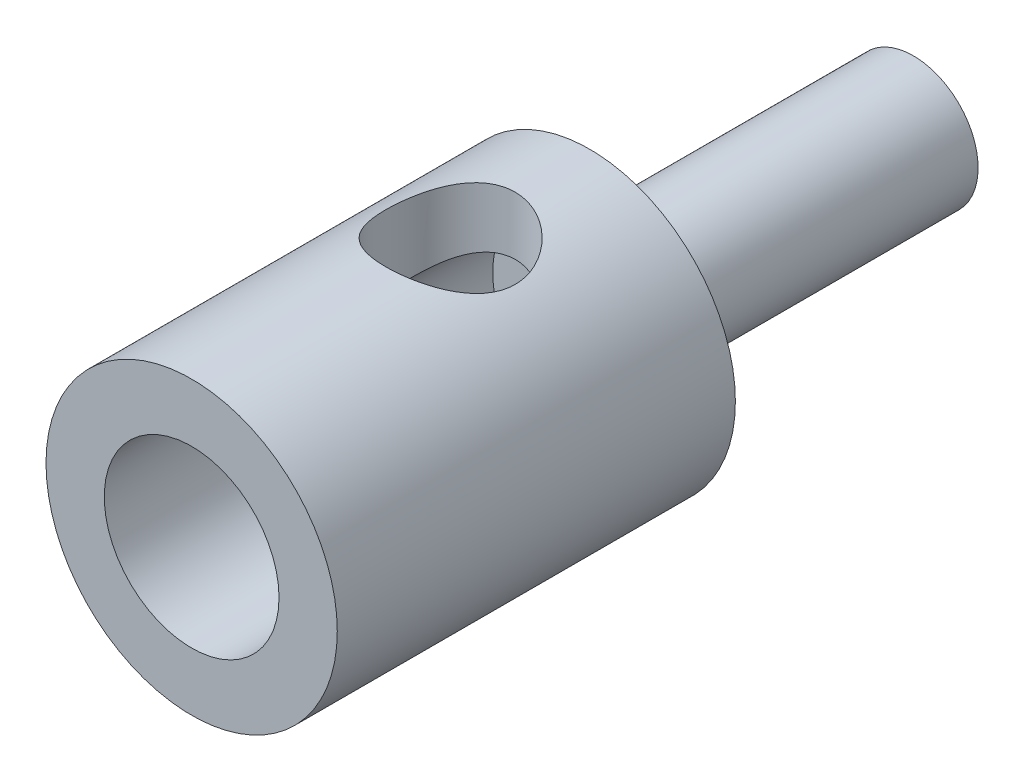
ISO-10303-21;
HEADER;
FILE_DESCRIPTION(('STEP AP214'),'2;1');
FILE_NAME('part.step','',(''),(''),'','','');
FILE_SCHEMA(('AUTOMOTIVE_DESIGN { 1 0 10303 214 1 1 1 1 }'));
ENDSEC;
DATA;
#1=APPLICATION_CONTEXT('core data for automotive mechanical design processes');
#2=APPLICATION_PROTOCOL_DEFINITION('international standard','automotive_design',2000,#1);
#3=PRODUCT_CONTEXT('',#1,'mechanical');
#4=PRODUCT('Part','Part','',(#3));
#5=PRODUCT_RELATED_PRODUCT_CATEGORY('part','',(#4));
#6=PRODUCT_DEFINITION_FORMATION('','',#4);
#7=PRODUCT_DEFINITION_CONTEXT('part definition',#1,'design');
#8=PRODUCT_DEFINITION('design','',#6,#7);
#9=PRODUCT_DEFINITION_SHAPE('','',#8);
#10=(LENGTH_UNIT() NAMED_UNIT(*) SI_UNIT(.MILLI.,.METRE.));
#11=(NAMED_UNIT(*) PLANE_ANGLE_UNIT() SI_UNIT($,.RADIAN.));
#12=(NAMED_UNIT(*) SI_UNIT($,.STERADIAN.) SOLID_ANGLE_UNIT());
#13=UNCERTAINTY_MEASURE_WITH_UNIT(LENGTH_MEASURE(1.E-05),#10,'distance_accuracy_value','');
#14=(GEOMETRIC_REPRESENTATION_CONTEXT(3) GLOBAL_UNCERTAINTY_ASSIGNED_CONTEXT((#13)) GLOBAL_UNIT_ASSIGNED_CONTEXT((#10,
#11,#12)) REPRESENTATION_CONTEXT('',''));
#15=CARTESIAN_POINT('',(0.,0.,0.));
#16=DIRECTION('',(0.,0.,1.));
#17=DIRECTION('',(1.,0.,0.));
#18=AXIS2_PLACEMENT_3D('',#15,#16,#17);
#19=CARTESIAN_POINT('',(0.,0.,6.15));
#20=DIRECTION('',(0.,0.,-1.));
#21=DIRECTION('',(-1.,0.,0.));
#22=AXIS2_PLACEMENT_3D('',#19,#20,#21);
#23=CYLINDRICAL_SURFACE('',#22,2.25);
#24=CARTESIAN_POINT('',(0.,2.25,1.15));
#25=CARTESIAN_POINT('',(0.0532554659185888,2.24999511135048,1.15000634735056));
#26=CARTESIAN_POINT('',(0.106577530436506,2.24808803498228,1.15427875681069));
#27=CARTESIAN_POINT('',(0.211696313341408,2.24064250175497,1.17120818566956));
#28=CARTESIAN_POINT('',(0.263489053440063,2.23509531958046,1.18388535198421));
#29=CARTESIAN_POINT('',(0.363850916966471,2.22096174879085,1.21705050914179));
#30=CARTESIAN_POINT('',(0.412430824006016,2.21238621117243,1.23751063256734));
#31=CARTESIAN_POINT('',(0.505415730249007,2.19301475825376,1.28553756681614));
#32=CARTESIAN_POINT('',(0.549821677957487,2.1822193491909,1.31310275770515));
#33=CARTESIAN_POINT('',(0.635739992499942,2.15879993616987,1.37616744140146));
#34=CARTESIAN_POINT('',(0.676990818164825,2.14611090344928,1.41199882728389));
#35=CARTESIAN_POINT('',(0.753128325004851,2.12059265317293,1.48987412590395));
#36=CARTESIAN_POINT('',(0.788011212567855,2.10776335684879,1.53192171504266));
#37=CARTESIAN_POINT('',(0.852423036191427,2.08258023551527,1.62396936266794));
#38=CARTESIAN_POINT('',(0.881526558016591,2.07029663189321,1.67428840760411));
#39=CARTESIAN_POINT('',(0.930740290188398,2.04864605580411,1.77972762300731));
#40=CARTESIAN_POINT('',(0.950855750666059,2.03927738163432,1.83484496813589));
#41=CARTESIAN_POINT('',(0.980405762251773,2.02523112420835,1.94531019032072));
#42=CARTESIAN_POINT('',(0.990346584909238,2.02033266269295,2.00049336723043));
#43=CARTESIAN_POINT('',(1.00083914149177,2.01515731968729,2.11194488505288));
#44=CARTESIAN_POINT('',(1.00139714603473,2.01487735162058,2.1682124760636));
#45=CARTESIAN_POINT('',(0.993485821512556,2.01878638355473,2.27484772432154));
#46=CARTESIAN_POINT('',(0.985820019509856,2.02257762855117,2.32529268458681));
#47=CARTESIAN_POINT('',(0.963040506308283,2.03352181022502,2.42408761247633));
#48=CARTESIAN_POINT('',(0.947925121354023,2.04067550235269,2.47243710663887));
#49=CARTESIAN_POINT('',(0.910376035627727,2.05770428570701,2.56696681386647));
#50=CARTESIAN_POINT('',(0.887785678682018,2.06763685897519,2.61307397257057));
#51=CARTESIAN_POINT('',(0.836040587446696,2.08909539162215,2.70103795723706));
#52=CARTESIAN_POINT('',(0.806883089335638,2.10062202107855,2.74289298287025));
#53=CARTESIAN_POINT('',(0.739504042519738,2.12533319458153,2.8254568007386));
#54=CARTESIAN_POINT('',(0.70067621379179,2.13856986016634,2.86565673920871));
#55=CARTESIAN_POINT('',(0.616719106061996,2.1642744980616,2.93915872177867));
#56=CARTESIAN_POINT('',(0.5715879288621,2.1767422371801,2.97245868047995));
#57=CARTESIAN_POINT('',(0.474576379255935,2.19996224486656,3.03210661386102));
#58=CARTESIAN_POINT('',(0.422536018799482,2.21065295965384,3.05822017159668));
#59=CARTESIAN_POINT('',(0.314203711433232,2.22862790336672,3.10113847495609));
#60=CARTESIAN_POINT('',(0.257914470354028,2.23591427938232,3.11794908911149));
#61=CARTESIAN_POINT('',(0.146910267747264,2.2458412921952,3.14065594134303));
#62=CARTESIAN_POINT('',(0.0923605815208482,2.24877123051482,3.14723334862549));
#63=CARTESIAN_POINT('',(-0.0171385193954918,2.2506000193263,3.15135156153442));
#64=CARTESIAN_POINT('',(-0.0720877919819429,2.24950023903332,3.14889543656749));
#65=CARTESIAN_POINT('',(-0.177453708369244,2.24357647772824,3.13547821365958));
#66=CARTESIAN_POINT('',(-0.227948208866323,2.23897258878825,3.12501955374025));
#67=CARTESIAN_POINT('',(-0.326396036479248,2.22675271157043,3.09662101044848));
#68=CARTESIAN_POINT('',(-0.37434905396292,2.21913635723226,3.07868021786873));
#69=CARTESIAN_POINT('',(-0.46805202596665,2.20131188670333,3.0352555587948));
#70=CARTESIAN_POINT('',(-0.513686576668193,2.19103032614157,3.00955382644281));
#71=CARTESIAN_POINT('',(-0.600159639375065,2.16894061525661,2.95157428699106));
#72=CARTESIAN_POINT('',(-0.640996050392065,2.15713180090545,2.91929361592732));
#73=CARTESIAN_POINT('',(-0.72018360626788,2.13206396576625,2.84604161010067));
#74=CARTESIAN_POINT('',(-0.75806919369852,2.1187647704964,2.80457953125976));
#75=CARTESIAN_POINT('',(-0.82650121133195,2.09302067475821,2.71572232984223));
#76=CARTESIAN_POINT('',(-0.857045039647483,2.08057607826871,2.66832511290301));
#77=CARTESIAN_POINT('',(-0.91053786568531,2.05773895078273,2.56743784609541));
#78=CARTESIAN_POINT('',(-0.933291638639681,2.04740148035177,2.51383084181563));
#79=CARTESIAN_POINT('',(-0.969232460087628,2.03063751400259,2.40293659234795));
#80=CARTESIAN_POINT('',(-0.982428871839502,2.02420719128545,2.34565300914476));
#81=CARTESIAN_POINT('',(-0.997892739114449,2.01662526778851,2.23425921190186));
#82=CARTESIAN_POINT('',(-1.00099172334628,2.01507244117414,2.18029156070324));
#83=CARTESIAN_POINT('',(-0.998453874399204,2.01633144598305,2.0726201984324));
#84=CARTESIAN_POINT('',(-0.992818903993759,2.01914234671295,2.01891643352912));
#85=CARTESIAN_POINT('',(-0.973701132763464,2.0284248239616,1.91665403625126));
#86=CARTESIAN_POINT('',(-0.960710860144593,2.03466599695481,1.86798024005687));
#87=CARTESIAN_POINT('',(-0.927770972929371,2.04989473409227,1.77350904090075));
#88=CARTESIAN_POINT('',(-0.907819346374624,2.05888309212992,1.72771247403129));
#89=CARTESIAN_POINT('',(-0.860060545804444,2.07930527884415,1.63708119418944));
#90=CARTESIAN_POINT('',(-0.831831914674672,2.09085890484882,1.59249616870949));
#91=CARTESIAN_POINT('',(-0.768867986661113,2.11482294535827,1.50843759973141));
#92=CARTESIAN_POINT('',(-0.734129972078894,2.12723371635363,1.46896620288178));
#93=CARTESIAN_POINT('',(-0.655540642347484,2.15281618226999,1.39268876734829));
#94=CARTESIAN_POINT('',(-0.611157950232165,2.16595947242195,1.35641791728769));
#95=CARTESIAN_POINT('',(-0.516475905666192,2.19046588398484,1.29178249272621));
#96=CARTESIAN_POINT('',(-0.466173865202286,2.20182819113615,1.26342153000878));
#97=CARTESIAN_POINT('',(-0.361525056195783,2.22139629471516,1.21588769398026));
#98=CARTESIAN_POINT('',(-0.307230454369046,2.22963633024829,1.19661455362951));
#99=CARTESIAN_POINT('',(-0.195810676259318,2.24215858416623,1.16768151182));
#100=CARTESIAN_POINT('',(-0.138694699549948,2.24645287290451,1.15799228540073));
#101=CARTESIAN_POINT('',(-0.054182016207977,2.24951242368149,1.15109819230376));
#102=CARTESIAN_POINT('',(-0.0270996306091857,2.25000248764317,1.14999677008073));
#103=CARTESIAN_POINT('',(0.,2.25,1.15));
#104=B_SPLINE_CURVE_WITH_KNOTS('',3,(#24,#25,#26,#27,#28,#29,#30,#31,#32,#33,#34,#35,#36,#37,
#38,#39,#40,#41,#42,#43,#44,#45,#46,#47,#48,#49,#50,#51,#52,#53,#54,#55,#56,#57,#58,#59,#60,#61,
#62,#63,#64,#65,#66,#67,#68,#69,#70,#71,#72,#73,#74,#75,#76,#77,#78,#79,#80,#81,#82,#83,#84,#85,
#86,#87,#88,#89,#90,#91,#92,#93,#94,#95,#96,#97,#98,#99,#100,#101,#102,#103),.UNSPECIFIED.,.T.,
.F.,(4,2,2,2,2,2,2,2,2,2,2,2,2,2,2,2,2,2,2,2,2,2,2,2,2,2,2,2,2,2,2,2,2,2,2,2,2,2,2,4),(0.,
0.159681878910111,0.319747919519924,0.479246146549302,0.638708040574723,0.806269554300142,
0.973930567049548,1.15127198270406,1.32850967335026,1.49642237746342,1.66422285961174,
1.81700425015333,1.96981998293039,2.12606592660329,2.28237775061561,2.45391673374921,
2.62550748617086,2.80216697951325,2.97871490418316,3.1429140648838,3.30705743927524,
3.46166393102078,3.61628921558037,3.7757384777183,3.93525730063716,4.1076325833433,
4.28006886532161,4.45655507823355,4.63286815448326,4.79423699929667,4.95557143217939,
5.10719982475701,5.2588720770592,5.4202634852214,5.58172242580081,5.75730509177075,
5.93296780087361,6.10664422570444,6.27978757430918,6.36104345779088),.UNSPECIFIED.);
#105=CARTESIAN_POINT('',(0.,2.25,1.15));
#106=VERTEX_POINT('',#105);
#107=EDGE_CURVE('E94',#106,#106,#104,.T.);
#108=ORIENTED_EDGE('',*,*,#107,.T.);
#109=EDGE_LOOP('',(#108));
#110=FACE_BOUND('',#109,.T.);
#111=CARTESIAN_POINT('',(0.,-2.25,1.15));
#112=CARTESIAN_POINT('',(-0.0532554659185888,-2.24999511135048,1.15000634735056));
#113=CARTESIAN_POINT('',(-0.106577530436506,-2.24808803498228,1.15427875681069));
#114=CARTESIAN_POINT('',(-0.211696313341408,-2.24064250175497,1.17120818566956));
#115=CARTESIAN_POINT('',(-0.263489053440063,-2.23509531958046,1.18388535198421));
#116=CARTESIAN_POINT('',(-0.363850916966471,-2.22096174879085,1.21705050914179));
#117=CARTESIAN_POINT('',(-0.412430824006016,-2.21238621117243,1.23751063256734));
#118=CARTESIAN_POINT('',(-0.505415730249007,-2.19301475825376,1.28553756681614));
#119=CARTESIAN_POINT('',(-0.549821677957487,-2.1822193491909,1.31310275770515));
#120=CARTESIAN_POINT('',(-0.635739992499942,-2.15879993616987,1.37616744140146));
#121=CARTESIAN_POINT('',(-0.676990818164825,-2.14611090344928,1.41199882728389));
#122=CARTESIAN_POINT('',(-0.753128325004851,-2.12059265317293,1.48987412590395));
#123=CARTESIAN_POINT('',(-0.788011212567855,-2.10776335684879,1.53192171504266));
#124=CARTESIAN_POINT('',(-0.852423036191427,-2.08258023551527,1.62396936266794));
#125=CARTESIAN_POINT('',(-0.881526558016591,-2.07029663189321,1.67428840760411));
#126=CARTESIAN_POINT('',(-0.930740290188398,-2.04864605580411,1.77972762300731));
#127=CARTESIAN_POINT('',(-0.950855750666059,-2.03927738163432,1.83484496813589));
#128=CARTESIAN_POINT('',(-0.980405762251773,-2.02523112420835,1.94531019032072));
#129=CARTESIAN_POINT('',(-0.990346584909238,-2.02033266269295,2.00049336723043));
#130=CARTESIAN_POINT('',(-1.00083914149177,-2.01515731968729,2.11194488505288));
#131=CARTESIAN_POINT('',(-1.00139714603473,-2.01487735162058,2.1682124760636));
#132=CARTESIAN_POINT('',(-0.993485821512556,-2.01878638355473,2.27484772432154));
#133=CARTESIAN_POINT('',(-0.985820019509856,-2.02257762855117,2.32529268458681));
#134=CARTESIAN_POINT('',(-0.963040506308283,-2.03352181022502,2.42408761247633));
#135=CARTESIAN_POINT('',(-0.947925121354023,-2.04067550235269,2.47243710663887));
#136=CARTESIAN_POINT('',(-0.910376035627727,-2.05770428570701,2.56696681386647));
#137=CARTESIAN_POINT('',(-0.887785678682018,-2.06763685897519,2.61307397257057));
#138=CARTESIAN_POINT('',(-0.836040587446696,-2.08909539162215,2.70103795723706));
#139=CARTESIAN_POINT('',(-0.806883089335638,-2.10062202107855,2.74289298287025));
#140=CARTESIAN_POINT('',(-0.739504042519738,-2.12533319458153,2.8254568007386));
#141=CARTESIAN_POINT('',(-0.70067621379179,-2.13856986016634,2.86565673920871));
#142=CARTESIAN_POINT('',(-0.616719106061996,-2.1642744980616,2.93915872177867));
#143=CARTESIAN_POINT('',(-0.5715879288621,-2.1767422371801,2.97245868047995));
#144=CARTESIAN_POINT('',(-0.474576379255935,-2.19996224486656,3.03210661386102));
#145=CARTESIAN_POINT('',(-0.422536018799482,-2.21065295965384,3.05822017159668));
#146=CARTESIAN_POINT('',(-0.314203711433232,-2.22862790336672,3.10113847495609));
#147=CARTESIAN_POINT('',(-0.257914470354028,-2.23591427938232,3.11794908911149));
#148=CARTESIAN_POINT('',(-0.146910267747264,-2.2458412921952,3.14065594134303));
#149=CARTESIAN_POINT('',(-0.0923605815208482,-2.24877123051482,3.14723334862549));
#150=CARTESIAN_POINT('',(0.0171385193954918,-2.2506000193263,3.15135156153442));
#151=CARTESIAN_POINT('',(0.0720877919819429,-2.24950023903332,3.14889543656749));
#152=CARTESIAN_POINT('',(0.177453708369244,-2.24357647772824,3.13547821365958));
#153=CARTESIAN_POINT('',(0.227948208866323,-2.23897258878825,3.12501955374025));
#154=CARTESIAN_POINT('',(0.326396036479248,-2.22675271157043,3.09662101044848));
#155=CARTESIAN_POINT('',(0.37434905396292,-2.21913635723226,3.07868021786873));
#156=CARTESIAN_POINT('',(0.46805202596665,-2.20131188670333,3.0352555587948));
#157=CARTESIAN_POINT('',(0.513686576668193,-2.19103032614157,3.00955382644281));
#158=CARTESIAN_POINT('',(0.600159639375065,-2.16894061525661,2.95157428699106));
#159=CARTESIAN_POINT('',(0.640996050392065,-2.15713180090545,2.91929361592732));
#160=CARTESIAN_POINT('',(0.72018360626788,-2.13206396576625,2.84604161010067));
#161=CARTESIAN_POINT('',(0.75806919369852,-2.1187647704964,2.80457953125976));
#162=CARTESIAN_POINT('',(0.82650121133195,-2.09302067475821,2.71572232984223));
#163=CARTESIAN_POINT('',(0.857045039647483,-2.08057607826871,2.66832511290301));
#164=CARTESIAN_POINT('',(0.91053786568531,-2.05773895078273,2.56743784609541));
#165=CARTESIAN_POINT('',(0.933291638639681,-2.04740148035177,2.51383084181563));
#166=CARTESIAN_POINT('',(0.969232460087628,-2.03063751400259,2.40293659234795));
#167=CARTESIAN_POINT('',(0.982428871839502,-2.02420719128545,2.34565300914476));
#168=CARTESIAN_POINT('',(0.997892739114449,-2.01662526778851,2.23425921190186));
#169=CARTESIAN_POINT('',(1.00099172334628,-2.01507244117414,2.18029156070324));
#170=CARTESIAN_POINT('',(0.998453874399204,-2.01633144598305,2.0726201984324));
#171=CARTESIAN_POINT('',(0.992818903993759,-2.01914234671295,2.01891643352912));
#172=CARTESIAN_POINT('',(0.973701132763464,-2.0284248239616,1.91665403625126));
#173=CARTESIAN_POINT('',(0.960710860144593,-2.03466599695481,1.86798024005687));
#174=CARTESIAN_POINT('',(0.927770972929371,-2.04989473409227,1.77350904090075));
#175=CARTESIAN_POINT('',(0.907819346374624,-2.05888309212992,1.72771247403129));
#176=CARTESIAN_POINT('',(0.860060545804444,-2.07930527884415,1.63708119418944));
#177=CARTESIAN_POINT('',(0.831831914674672,-2.09085890484882,1.59249616870949));
#178=CARTESIAN_POINT('',(0.768867986661113,-2.11482294535827,1.50843759973141));
#179=CARTESIAN_POINT('',(0.734129972078894,-2.12723371635363,1.46896620288178));
#180=CARTESIAN_POINT('',(0.655540642347484,-2.15281618226999,1.39268876734829));
#181=CARTESIAN_POINT('',(0.611157950232165,-2.16595947242195,1.35641791728769));
#182=CARTESIAN_POINT('',(0.516475905666192,-2.19046588398484,1.29178249272621));
#183=CARTESIAN_POINT('',(0.466173865202286,-2.20182819113615,1.26342153000878));
#184=CARTESIAN_POINT('',(0.361525056195783,-2.22139629471516,1.21588769398026));
#185=CARTESIAN_POINT('',(0.307230454369046,-2.22963633024829,1.19661455362951));
#186=CARTESIAN_POINT('',(0.195810676259318,-2.24215858416623,1.16768151182));
#187=CARTESIAN_POINT('',(0.138694699549948,-2.24645287290451,1.15799228540073));
#188=CARTESIAN_POINT('',(0.054182016207977,-2.24951242368149,1.15109819230376));
#189=CARTESIAN_POINT('',(0.0270996306091857,-2.25000248764317,1.14999677008073));
#190=CARTESIAN_POINT('',(0.,-2.25,1.15));
#191=B_SPLINE_CURVE_WITH_KNOTS('',3,(#111,#112,#113,#114,#115,#116,#117,#118,#119,#120,#121,
#122,#123,#124,#125,#126,#127,#128,#129,#130,#131,#132,#133,#134,#135,#136,#137,#138,#139,#140,
#141,#142,#143,#144,#145,#146,#147,#148,#149,#150,#151,#152,#153,#154,#155,#156,#157,#158,#159,
#160,#161,#162,#163,#164,#165,#166,#167,#168,#169,#170,#171,#172,#173,#174,#175,#176,#177,#178,
#179,#180,#181,#182,#183,#184,#185,#186,#187,#188,#189,#190),.UNSPECIFIED.,.T.,.F.,(4,2,2,2,2,2,
2,2,2,2,2,2,2,2,2,2,2,2,2,2,2,2,2,2,2,2,2,2,2,2,2,2,2,2,2,2,2,2,2,4),(0.,0.159681878910111,
0.319747919519924,0.479246146549302,0.638708040574723,0.806269554300142,0.973930567049548,
1.15127198270406,1.32850967335026,1.49642237746342,1.66422285961174,1.81700425015333,
1.96981998293039,2.12606592660329,2.28237775061561,2.45391673374921,2.62550748617086,
2.80216697951325,2.97871490418316,3.1429140648838,3.30705743927524,3.46166393102078,
3.61628921558037,3.7757384777183,3.93525730063716,4.1076325833433,4.28006886532161,
4.45655507823355,4.63286815448326,4.79423699929667,4.95557143217939,5.10719982475701,
5.2588720770592,5.4202634852214,5.58172242580081,5.75730509177075,5.93296780087361,
6.10664422570444,6.27978757430918,6.36104345779088),.UNSPECIFIED.);
#192=CARTESIAN_POINT('',(0.,-2.25,1.15));
#193=VERTEX_POINT('',#192);
#194=EDGE_CURVE('E100',#193,#193,#191,.T.);
#195=ORIENTED_EDGE('',*,*,#194,.T.);
#196=EDGE_LOOP('',(#195));
#197=FACE_BOUND('',#196,.T.);
#198=CARTESIAN_POINT('',(0.,0.,6.15));
#199=DIRECTION('',(0.,0.,1.));
#200=DIRECTION('',(1.,0.,0.));
#201=AXIS2_PLACEMENT_3D('',#198,#199,#200);
#202=CIRCLE('',#201,2.25);
#203=CARTESIAN_POINT('',(2.25,0.,6.15));
#204=VERTEX_POINT('',#203);
#205=EDGE_CURVE('E57',#204,#204,#202,.T.);
#206=ORIENTED_EDGE('',*,*,#205,.F.);
#207=EDGE_LOOP('',(#206));
#208=FACE_BOUND('',#207,.T.);
#209=CARTESIAN_POINT('',(0.,0.,0.));
#210=DIRECTION('',(0.,0.,1.));
#211=DIRECTION('',(1.,0.,0.));
#212=AXIS2_PLACEMENT_3D('',#209,#210,#211);
#213=CIRCLE('',#212,2.25);
#214=CARTESIAN_POINT('',(2.25,0.,0.));
#215=VERTEX_POINT('',#214);
#216=EDGE_CURVE('E65',#215,#215,#213,.T.);
#217=ORIENTED_EDGE('',*,*,#216,.T.);
#218=EDGE_LOOP('',(#217));
#219=FACE_BOUND('',#218,.T.);
#220=ADVANCED_FACE('F43',(#110,#197,#208,#219),#23,.T.);
#221=CARTESIAN_POINT('',(0.,0.,6.15));
#222=DIRECTION('',(0.,0.,1.));
#223=DIRECTION('',(1.,0.,0.));
#224=AXIS2_PLACEMENT_3D('',#221,#222,#223);
#225=PLANE('',#224);
#226=CARTESIAN_POINT('',(0.,0.,6.15));
#227=DIRECTION('',(0.,0.,1.));
#228=DIRECTION('',(1.,0.,0.));
#229=AXIS2_PLACEMENT_3D('',#226,#227,#228);
#230=CIRCLE('',#229,1.35);
#231=CARTESIAN_POINT('',(1.35,0.,6.15));
#232=VERTEX_POINT('',#231);
#233=EDGE_CURVE('E107',#232,#232,#230,.T.);
#234=ORIENTED_EDGE('',*,*,#233,.F.);
#235=EDGE_LOOP('',(#234));
#236=FACE_BOUND('',#235,.T.);
#237=ORIENTED_EDGE('',*,*,#205,.T.);
#238=EDGE_LOOP('',(#237));
#239=FACE_BOUND('',#238,.T.);
#240=ADVANCED_FACE('F114',(#236,#239),#225,.T.);
#241=CARTESIAN_POINT('',(0.,0.,0.));
#242=DIRECTION('',(0.,0.,1.));
#243=DIRECTION('',(1.,0.,0.));
#244=AXIS2_PLACEMENT_3D('',#241,#242,#243);
#245=PLANE('',#244);
#246=CARTESIAN_POINT('',(0.,0.,0.));
#247=DIRECTION('',(0.,0.,-1.));
#248=DIRECTION('',(-1.,0.,0.));
#249=AXIS2_PLACEMENT_3D('',#246,#247,#248);
#250=CIRCLE('',#249,1.);
#251=CARTESIAN_POINT('',(-1.,0.,0.));
#252=VERTEX_POINT('',#251);
#253=EDGE_CURVE('E10',#252,#252,#250,.T.);
#254=ORIENTED_EDGE('',*,*,#253,.F.);
#255=EDGE_LOOP('',(#254));
#256=FACE_BOUND('',#255,.T.);
#257=ORIENTED_EDGE('',*,*,#216,.F.);
#258=EDGE_LOOP('',(#257));
#259=FACE_BOUND('',#258,.T.);
#260=ADVANCED_FACE('F117',(#256,#259),#245,.F.);
#261=CARTESIAN_POINT('',(0.,0.,-5.));
#262=DIRECTION('',(0.,0.,1.));
#263=DIRECTION('',(1.,0.,0.));
#264=AXIS2_PLACEMENT_3D('',#261,#262,#263);
#265=CYLINDRICAL_SURFACE('',#264,1.);
#266=CARTESIAN_POINT('',(0.,0.,-5.));
#267=DIRECTION('',(0.,0.,-1.));
#268=DIRECTION('',(-1.,0.,0.));
#269=AXIS2_PLACEMENT_3D('',#266,#267,#268);
#270=CIRCLE('',#269,1.);
#271=CARTESIAN_POINT('',(-1.,0.,-5.));
#272=VERTEX_POINT('',#271);
#273=EDGE_CURVE('E68',#272,#272,#270,.T.);
#274=ORIENTED_EDGE('',*,*,#273,.F.);
#275=EDGE_LOOP('',(#274));
#276=FACE_BOUND('',#275,.T.);
#277=ORIENTED_EDGE('',*,*,#253,.T.);
#278=EDGE_LOOP('',(#277));
#279=FACE_BOUND('',#278,.T.);
#280=ADVANCED_FACE('F127',(#276,#279),#265,.T.);
#281=CARTESIAN_POINT('',(0.,0.,-5.));
#282=DIRECTION('',(0.,0.,-1.));
#283=DIRECTION('',(-1.,0.,0.));
#284=AXIS2_PLACEMENT_3D('',#281,#282,#283);
#285=PLANE('',#284);
#286=ORIENTED_EDGE('',*,*,#273,.T.);
#287=EDGE_LOOP('',(#286));
#288=FACE_BOUND('',#287,.T.);
#289=ADVANCED_FACE('F132',(#288),#285,.T.);
#290=CARTESIAN_POINT('',(0.,0.,0.15));
#291=DIRECTION('',(0.,0.,1.));
#292=DIRECTION('',(1.,0.,0.));
#293=AXIS2_PLACEMENT_3D('',#290,#291,#292);
#294=CYLINDRICAL_SURFACE('',#293,1.35);
#295=CARTESIAN_POINT('',(0.,1.35,1.15));
#296=CARTESIAN_POINT('',(-0.0490717243035297,1.35000223958817,1.14999761075042));
#297=CARTESIAN_POINT('',(-0.098131527834166,1.34730318767984,1.1536319930467));
#298=CARTESIAN_POINT('',(-0.194651752872078,1.33677541611671,1.16791458289833));
#299=CARTESIAN_POINT('',(-0.242111641312055,1.32894500418981,1.17856510431352));
#300=CARTESIAN_POINT('',(-0.333870770469534,1.3089034146169,1.20616878180187));
#301=CARTESIAN_POINT('',(-0.378184866096066,1.29671473262148,1.22308958917346));
#302=CARTESIAN_POINT('',(-0.463083361505913,1.26887833136965,1.26244967274579));
#303=CARTESIAN_POINT('',(-0.503667230400916,1.25323012082673,1.28488973278476));
#304=CARTESIAN_POINT('',(-0.58417717297009,1.21792535804948,1.33683361656571));
#305=CARTESIAN_POINT('',(-0.623701191131471,1.19803275892706,1.36679666251675));
#306=CARTESIAN_POINT('',(-0.697500695042431,1.15662763822648,1.43172886689919));
#307=CARTESIAN_POINT('',(-0.731768230666145,1.13511273489584,1.466705456455));
#308=CARTESIAN_POINT('',(-0.801079533032903,1.08759585552227,1.54858699270101));
#309=CARTESIAN_POINT('',(-0.834929570439393,1.06155017084429,1.59648192814709));
#310=CARTESIAN_POINT('',(-0.894205867179263,1.0121158231843,1.69848540570644));
#311=CARTESIAN_POINT('',(-0.919644134856284,0.988723404133989,1.75258494035072));
#312=CARTESIAN_POINT('',(-0.953952551643106,0.955427946519688,1.84737271356679));
#313=CARTESIAN_POINT('',(-0.965516567615825,0.94363789556465,1.88641387459037));
#314=CARTESIAN_POINT('',(-0.983895804701379,0.924460441098843,1.96660577971819));
#315=CARTESIAN_POINT('',(-0.990721885133291,0.91706297547546,2.00775146609966));
#316=CARTESIAN_POINT('',(-0.999185249946116,0.907839671356762,2.09157556821471));
#317=CARTESIAN_POINT('',(-1.0007793895189,0.906060165492432,2.13426380795081));
#318=CARTESIAN_POINT('',(-0.998502556508989,0.908566985857605,2.21932446867285));
#319=CARTESIAN_POINT('',(-0.994628273066616,0.912856986877067,2.26169668270244));
#320=CARTESIAN_POINT('',(-0.981115555029069,0.927370280583237,2.348874750766));
#321=CARTESIAN_POINT('',(-0.970940040374505,0.938143399992382,2.39350096303103));
#322=CARTESIAN_POINT('',(-0.945130171365865,0.964138108515908,2.47980086560265));
#323=CARTESIAN_POINT('',(-0.9294826291478,0.979370429956593,2.52146712774571));
#324=CARTESIAN_POINT('',(-0.886735859817576,1.01848525160047,2.61615469137081));
#325=CARTESIAN_POINT('',(-0.857541399939727,1.04349429270473,2.66775844080754));
#326=CARTESIAN_POINT('',(-0.79097571458433,1.0948207780191,2.76466874412697));
#327=CARTESIAN_POINT('',(-0.753594666539317,1.121139764382,2.80996762548786));
#328=CARTESIAN_POINT('',(-0.670363283866524,1.17284028179552,2.89443422896834));
#329=CARTESIAN_POINT('',(-0.624386421129005,1.1981999315268,2.93349164148448));
#330=CARTESIAN_POINT('',(-0.524847379484645,1.24500733203476,3.00335341713868));
#331=CARTESIAN_POINT('',(-0.471302885117067,1.26646394363861,3.03417655059703));
#332=CARTESIAN_POINT('',(-0.37217493891926,1.29844813399917,3.0793276670848));
#333=CARTESIAN_POINT('',(-0.328041936106571,1.31036740074748,3.09585759036153));
#334=CARTESIAN_POINT('',(-0.236993197669999,1.32984761073527,3.12266666158623));
#335=CARTESIAN_POINT('',(-0.190079553513427,1.3374117849178,3.13295044371466));
#336=CARTESIAN_POINT('',(-0.0945149659758822,1.34754743054154,3.14669750240256));
#337=CARTESIAN_POINT('',(-0.0458575688449894,1.35009785695702,3.15013203033064));
#338=CARTESIAN_POINT('',(0.051427436938527,1.34989639797072,3.14986021381215));
#339=CARTESIAN_POINT('',(0.100055046620466,1.34714470748688,3.14615413187072));
#340=CARTESIAN_POINT('',(0.192533030764888,1.33695695325939,3.13233062657074));
#341=CARTESIAN_POINT('',(0.236486822410695,1.32984222412193,3.12265274097884));
#342=CARTESIAN_POINT('',(0.321966443541335,1.3117728028136,3.09779771411183));
#343=CARTESIAN_POINT('',(0.363491758542286,1.30081730037128,3.08261941241477));
#344=CARTESIAN_POINT('',(0.446372248270804,1.27486321842537,3.04607713274766));
#345=CARTESIAN_POINT('',(0.48748443264255,1.25962429651608,3.02433666465163));
#346=CARTESIAN_POINT('',(0.565574142868966,1.22655100703494,2.97597731805618));
#347=CARTESIAN_POINT('',(0.602549344166405,1.20871519310173,2.94935571881219));
#348=CARTESIAN_POINT('',(0.678478454197445,1.16805139544047,2.88655988190553));
#349=CARTESIAN_POINT('',(0.716553983723964,1.14490744378254,2.84952907978374));
#350=CARTESIAN_POINT('',(0.786329676176369,1.09815758084091,2.77006961391989));
#351=CARTESIAN_POINT('',(0.818023016732996,1.07455120449709,2.72763525217465));
#352=CARTESIAN_POINT('',(0.87252924665869,1.03069002461333,2.64103153398405));
#353=CARTESIAN_POINT('',(0.89582953970162,1.01031662286695,2.59723029909677));
#354=CARTESIAN_POINT('',(0.936057320801927,0.973162776943834,2.50538453335311));
#355=CARTESIAN_POINT('',(0.952997878774205,0.956374994914658,2.45734895832853));
#356=CARTESIAN_POINT('',(0.976280930310418,0.932514509650264,2.36995445519327));
#357=CARTESIAN_POINT('',(0.984210685547723,0.924064443664157,2.33140401470098));
#358=CARTESIAN_POINT('',(0.995475124557304,0.911921417780413,2.25292697486378));
#359=CARTESIAN_POINT('',(0.998817653969926,0.908220336289793,2.21300284519185));
#360=CARTESIAN_POINT('',(1.00065851417375,0.906192808331507,2.1327690139263));
#361=CARTESIAN_POINT('',(0.999141226076505,0.907883690932647,2.0924584851127));
#362=CARTESIAN_POINT('',(0.991358199771393,0.916372877620256,2.01283134757953));
#363=CARTESIAN_POINT('',(0.985085969923593,0.923178163988816,1.97351617365482));
#364=CARTESIAN_POINT('',(0.965986894362039,0.943188224365731,1.88668524698419));
#365=CARTESIAN_POINT('',(0.95186740806068,0.957607617787472,1.83974221969862));
#366=CARTESIAN_POINT('',(0.917614165519523,0.990478273590003,1.74959703246288));
#367=CARTESIAN_POINT('',(0.897465480953337,1.00893951279608,1.70640450529888));
#368=CARTESIAN_POINT('',(0.844888465115746,1.05365160383911,1.61155476449035));
#369=CARTESIAN_POINT('',(0.810589555757431,1.0805766470421,1.56125173447328));
#370=CARTESIAN_POINT('',(0.733475694621197,1.13434152561778,1.46758246147642));
#371=CARTESIAN_POINT('',(0.690655505444754,1.16118129822226,1.42422051438782));
#372=CARTESIAN_POINT('',(0.596655694577723,1.21217706605328,1.3451489279007));
#373=CARTESIAN_POINT('',(0.545444067672191,1.23632216658571,1.30946984652661));
#374=CARTESIAN_POINT('',(0.435547933022253,1.27916084607129,1.24764324063053));
#375=CARTESIAN_POINT('',(0.376881113085337,1.29786699458456,1.22147370374177));
#376=CARTESIAN_POINT('',(0.265417067422596,1.32464951887635,1.18442994291885));
#377=CARTESIAN_POINT('',(0.213593537518461,1.33406395310874,1.1716039054084));
#378=CARTESIAN_POINT('',(0.107840249584173,1.34673450020864,1.15439499457995));
#379=CARTESIAN_POINT('',(0.0539129303411255,1.34999753946366,1.15000262496271));
#380=CARTESIAN_POINT('',(0.,1.35,1.15));
#381=B_SPLINE_CURVE_WITH_KNOTS('',3,(#295,#296,#297,#298,#299,#300,#301,#302,#303,#304,#305,
#306,#307,#308,#309,#310,#311,#312,#313,#314,#315,#316,#317,#318,#319,#320,#321,#322,#323,#324,
#325,#326,#327,#328,#329,#330,#331,#332,#333,#334,#335,#336,#337,#338,#339,#340,#341,#342,#343,
#344,#345,#346,#347,#348,#349,#350,#351,#352,#353,#354,#355,#356,#357,#358,#359,#360,#361,#362,
#363,#364,#365,#366,#367,#368,#369,#370,#371,#372,#373,#374,#375,#376,#377,#378,#379,#380),
.UNSPECIFIED.,.T.,.F.,(4,2,2,2,2,2,2,2,2,2,2,2,2,2,2,2,2,2,2,2,2,2,2,2,2,2,2,2,2,2,2,2,2,2,2,2,
2,2,2,2,2,2,4),(0.,0.146995166442966,0.294038834860604,0.440334226319851,0.586650406499752,
0.746392274220136,0.906373409430832,1.09808076918562,1.28951326079399,1.4162453033043,
1.54268590895595,1.67016661195075,1.79772453132269,1.93802310310116,2.07866215869118,
2.27071665872335,2.46300286768751,2.65838123640217,2.85331035779576,2.9985448061043,
3.14367136901715,3.28940580567434,3.43513488490278,3.57124065956314,3.70737516517045,
3.85364824385415,4.00000310445577,4.17316900947653,4.34651905235811,4.50688275077582,
4.66691505721501,4.7871969324066,4.90727282921303,5.02773502274915,5.14836197301036,
5.30081106197179,5.45364078372119,5.65237421541246,5.85123017316971,6.05086302515519,
6.25003078508705,6.41171002236896,6.57320710202939),.UNSPECIFIED.);
#382=CARTESIAN_POINT('',(0.,1.35,1.15));
#383=VERTEX_POINT('',#382);
#384=EDGE_CURVE('E47',#383,#383,#381,.T.);
#385=ORIENTED_EDGE('',*,*,#384,.T.);
#386=EDGE_LOOP('',(#385));
#387=FACE_BOUND('',#386,.T.);
#388=CARTESIAN_POINT('',(0.,-1.35,1.15));
#389=CARTESIAN_POINT('',(0.0490717243035297,-1.35000223958817,1.14999761075042));
#390=CARTESIAN_POINT('',(0.098131527834166,-1.34730318767984,1.1536319930467));
#391=CARTESIAN_POINT('',(0.194651752872078,-1.33677541611671,1.16791458289833));
#392=CARTESIAN_POINT('',(0.242111641312055,-1.32894500418981,1.17856510431352));
#393=CARTESIAN_POINT('',(0.333870770469534,-1.3089034146169,1.20616878180187));
#394=CARTESIAN_POINT('',(0.378184866096066,-1.29671473262148,1.22308958917346));
#395=CARTESIAN_POINT('',(0.463083361505913,-1.26887833136965,1.26244967274579));
#396=CARTESIAN_POINT('',(0.503667230400916,-1.25323012082673,1.28488973278476));
#397=CARTESIAN_POINT('',(0.58417717297009,-1.21792535804948,1.33683361656571));
#398=CARTESIAN_POINT('',(0.623701191131471,-1.19803275892706,1.36679666251675));
#399=CARTESIAN_POINT('',(0.697500695042431,-1.15662763822648,1.43172886689919));
#400=CARTESIAN_POINT('',(0.731768230666145,-1.13511273489584,1.466705456455));
#401=CARTESIAN_POINT('',(0.801079533032903,-1.08759585552227,1.54858699270101));
#402=CARTESIAN_POINT('',(0.834929570439393,-1.06155017084429,1.59648192814709));
#403=CARTESIAN_POINT('',(0.894205867179263,-1.0121158231843,1.69848540570644));
#404=CARTESIAN_POINT('',(0.919644134856284,-0.988723404133989,1.75258494035072));
#405=CARTESIAN_POINT('',(0.953952551643106,-0.955427946519688,1.84737271356679));
#406=CARTESIAN_POINT('',(0.965516567615825,-0.94363789556465,1.88641387459037));
#407=CARTESIAN_POINT('',(0.983895804701379,-0.924460441098843,1.96660577971819));
#408=CARTESIAN_POINT('',(0.990721885133291,-0.91706297547546,2.00775146609966));
#409=CARTESIAN_POINT('',(0.999185249946116,-0.907839671356762,2.09157556821471));
#410=CARTESIAN_POINT('',(1.0007793895189,-0.906060165492432,2.13426380795081));
#411=CARTESIAN_POINT('',(0.998502556508989,-0.908566985857605,2.21932446867285));
#412=CARTESIAN_POINT('',(0.994628273066616,-0.912856986877067,2.26169668270244));
#413=CARTESIAN_POINT('',(0.981115555029069,-0.927370280583237,2.348874750766));
#414=CARTESIAN_POINT('',(0.970940040374505,-0.938143399992382,2.39350096303103));
#415=CARTESIAN_POINT('',(0.945130171365865,-0.964138108515908,2.47980086560265));
#416=CARTESIAN_POINT('',(0.9294826291478,-0.979370429956593,2.52146712774571));
#417=CARTESIAN_POINT('',(0.886735859817576,-1.01848525160047,2.61615469137081));
#418=CARTESIAN_POINT('',(0.857541399939727,-1.04349429270473,2.66775844080754));
#419=CARTESIAN_POINT('',(0.79097571458433,-1.0948207780191,2.76466874412697));
#420=CARTESIAN_POINT('',(0.753594666539317,-1.121139764382,2.80996762548786));
#421=CARTESIAN_POINT('',(0.670363283866524,-1.17284028179552,2.89443422896834));
#422=CARTESIAN_POINT('',(0.624386421129005,-1.1981999315268,2.93349164148448));
#423=CARTESIAN_POINT('',(0.524847379484645,-1.24500733203476,3.00335341713868));
#424=CARTESIAN_POINT('',(0.471302885117067,-1.26646394363861,3.03417655059703));
#425=CARTESIAN_POINT('',(0.37217493891926,-1.29844813399917,3.0793276670848));
#426=CARTESIAN_POINT('',(0.328041936106571,-1.31036740074748,3.09585759036153));
#427=CARTESIAN_POINT('',(0.236993197669999,-1.32984761073527,3.12266666158623));
#428=CARTESIAN_POINT('',(0.190079553513427,-1.3374117849178,3.13295044371466));
#429=CARTESIAN_POINT('',(0.0945149659758822,-1.34754743054154,3.14669750240256));
#430=CARTESIAN_POINT('',(0.0458575688449894,-1.35009785695702,3.15013203033064));
#431=CARTESIAN_POINT('',(-0.051427436938527,-1.34989639797072,3.14986021381215));
#432=CARTESIAN_POINT('',(-0.100055046620466,-1.34714470748688,3.14615413187072));
#433=CARTESIAN_POINT('',(-0.192533030764888,-1.33695695325939,3.13233062657074));
#434=CARTESIAN_POINT('',(-0.236486822410695,-1.32984222412193,3.12265274097884));
#435=CARTESIAN_POINT('',(-0.321966443541335,-1.3117728028136,3.09779771411183));
#436=CARTESIAN_POINT('',(-0.363491758542286,-1.30081730037128,3.08261941241477));
#437=CARTESIAN_POINT('',(-0.446372248270804,-1.27486321842537,3.04607713274766));
#438=CARTESIAN_POINT('',(-0.48748443264255,-1.25962429651608,3.02433666465163));
#439=CARTESIAN_POINT('',(-0.565574142868966,-1.22655100703494,2.97597731805618));
#440=CARTESIAN_POINT('',(-0.602549344166405,-1.20871519310173,2.94935571881219));
#441=CARTESIAN_POINT('',(-0.678478454197445,-1.16805139544047,2.88655988190553));
#442=CARTESIAN_POINT('',(-0.716553983723964,-1.14490744378254,2.84952907978374));
#443=CARTESIAN_POINT('',(-0.786329676176369,-1.09815758084091,2.77006961391989));
#444=CARTESIAN_POINT('',(-0.818023016732996,-1.07455120449709,2.72763525217465));
#445=CARTESIAN_POINT('',(-0.87252924665869,-1.03069002461333,2.64103153398405));
#446=CARTESIAN_POINT('',(-0.89582953970162,-1.01031662286695,2.59723029909677));
#447=CARTESIAN_POINT('',(-0.936057320801927,-0.973162776943834,2.50538453335311));
#448=CARTESIAN_POINT('',(-0.952997878774205,-0.956374994914658,2.45734895832853));
#449=CARTESIAN_POINT('',(-0.976280930310418,-0.932514509650264,2.36995445519327));
#450=CARTESIAN_POINT('',(-0.984210685547723,-0.924064443664157,2.33140401470098));
#451=CARTESIAN_POINT('',(-0.995475124557304,-0.911921417780413,2.25292697486378));
#452=CARTESIAN_POINT('',(-0.998817653969926,-0.908220336289793,2.21300284519185));
#453=CARTESIAN_POINT('',(-1.00065851417375,-0.906192808331507,2.1327690139263));
#454=CARTESIAN_POINT('',(-0.999141226076505,-0.907883690932647,2.0924584851127));
#455=CARTESIAN_POINT('',(-0.991358199771393,-0.916372877620256,2.01283134757953));
#456=CARTESIAN_POINT('',(-0.985085969923593,-0.923178163988816,1.97351617365482));
#457=CARTESIAN_POINT('',(-0.965986894362039,-0.943188224365731,1.88668524698419));
#458=CARTESIAN_POINT('',(-0.95186740806068,-0.957607617787472,1.83974221969862));
#459=CARTESIAN_POINT('',(-0.917614165519523,-0.990478273590003,1.74959703246288));
#460=CARTESIAN_POINT('',(-0.897465480953337,-1.00893951279608,1.70640450529888));
#461=CARTESIAN_POINT('',(-0.844888465115746,-1.05365160383911,1.61155476449035));
#462=CARTESIAN_POINT('',(-0.810589555757431,-1.0805766470421,1.56125173447328));
#463=CARTESIAN_POINT('',(-0.733475694621197,-1.13434152561778,1.46758246147642));
#464=CARTESIAN_POINT('',(-0.690655505444754,-1.16118129822226,1.42422051438782));
#465=CARTESIAN_POINT('',(-0.596655694577723,-1.21217706605328,1.3451489279007));
#466=CARTESIAN_POINT('',(-0.545444067672191,-1.23632216658571,1.30946984652661));
#467=CARTESIAN_POINT('',(-0.435547933022253,-1.27916084607129,1.24764324063053));
#468=CARTESIAN_POINT('',(-0.376881113085337,-1.29786699458456,1.22147370374177));
#469=CARTESIAN_POINT('',(-0.265417067422596,-1.32464951887635,1.18442994291885));
#470=CARTESIAN_POINT('',(-0.213593537518461,-1.33406395310874,1.1716039054084));
#471=CARTESIAN_POINT('',(-0.107840249584173,-1.34673450020864,1.15439499457995));
#472=CARTESIAN_POINT('',(-0.0539129303411255,-1.34999753946366,1.15000262496271));
#473=CARTESIAN_POINT('',(0.,-1.35,1.15));
#474=B_SPLINE_CURVE_WITH_KNOTS('',3,(#388,#389,#390,#391,#392,#393,#394,#395,#396,#397,#398,
#399,#400,#401,#402,#403,#404,#405,#406,#407,#408,#409,#410,#411,#412,#413,#414,#415,#416,#417,
#418,#419,#420,#421,#422,#423,#424,#425,#426,#427,#428,#429,#430,#431,#432,#433,#434,#435,#436,
#437,#438,#439,#440,#441,#442,#443,#444,#445,#446,#447,#448,#449,#450,#451,#452,#453,#454,#455,
#456,#457,#458,#459,#460,#461,#462,#463,#464,#465,#466,#467,#468,#469,#470,#471,#472,#473),
.UNSPECIFIED.,.T.,.F.,(4,2,2,2,2,2,2,2,2,2,2,2,2,2,2,2,2,2,2,2,2,2,2,2,2,2,2,2,2,2,2,2,2,2,2,2,
2,2,2,2,2,2,4),(0.,0.146995166442966,0.294038834860604,0.440334226319851,0.586650406499752,
0.746392274220136,0.906373409430832,1.09808076918562,1.28951326079399,1.4162453033043,
1.54268590895595,1.67016661195075,1.79772453132269,1.93802310310116,2.07866215869118,
2.27071665872335,2.46300286768751,2.65838123640217,2.85331035779576,2.9985448061043,
3.14367136901715,3.28940580567434,3.43513488490278,3.57124065956314,3.70737516517045,
3.85364824385415,4.00000310445577,4.17316900947653,4.34651905235811,4.50688275077582,
4.66691505721501,4.7871969324066,4.90727282921303,5.02773502274915,5.14836197301036,
5.30081106197179,5.45364078372119,5.65237421541246,5.85123017316971,6.05086302515519,
6.25003078508705,6.41171002236896,6.57320710202939),.UNSPECIFIED.);
#475=CARTESIAN_POINT('',(0.,-1.35,1.15));
#476=VERTEX_POINT('',#475);
#477=EDGE_CURVE('E73',#476,#476,#474,.T.);
#478=ORIENTED_EDGE('',*,*,#477,.T.);
#479=EDGE_LOOP('',(#478));
#480=FACE_BOUND('',#479,.T.);
#481=CARTESIAN_POINT('',(0.,0.,0.15));
#482=DIRECTION('',(0.,0.,1.));
#483=DIRECTION('',(1.,0.,0.));
#484=AXIS2_PLACEMENT_3D('',#481,#482,#483);
#485=CIRCLE('',#484,1.35);
#486=CARTESIAN_POINT('',(1.35,0.,0.15));
#487=VERTEX_POINT('',#486);
#488=EDGE_CURVE('E108',#487,#487,#485,.T.);
#489=ORIENTED_EDGE('',*,*,#488,.F.);
#490=EDGE_LOOP('',(#489));
#491=FACE_BOUND('',#490,.T.);
#492=ORIENTED_EDGE('',*,*,#233,.T.);
#493=EDGE_LOOP('',(#492));
#494=FACE_BOUND('',#493,.T.);
#495=ADVANCED_FACE('F79',(#387,#480,#491,#494),#294,.F.);
#496=CARTESIAN_POINT('',(0.,0.,0.15));
#497=DIRECTION('',(0.,0.,1.));
#498=DIRECTION('',(1.,0.,0.));
#499=AXIS2_PLACEMENT_3D('',#496,#497,#498);
#500=PLANE('',#499);
#501=ORIENTED_EDGE('',*,*,#488,.T.);
#502=EDGE_LOOP('',(#501));
#503=FACE_BOUND('',#502,.T.);
#504=ADVANCED_FACE('F87',(#503),#500,.T.);
#505=CARTESIAN_POINT('',(0.,3.75,2.15));
#506=DIRECTION('',(0.,-1.,0.));
#507=DIRECTION('',(0.,0.,-1.));
#508=AXIS2_PLACEMENT_3D('',#505,#506,#507);
#509=CYLINDRICAL_SURFACE('',#508,1.);
#510=ORIENTED_EDGE('',*,*,#477,.F.);
#511=EDGE_LOOP('',(#510));
#512=FACE_BOUND('',#511,.T.);
#513=ORIENTED_EDGE('',*,*,#194,.F.);
#514=EDGE_LOOP('',(#513));
#515=FACE_BOUND('',#514,.T.);
#516=ADVANCED_FACE('F83',(#512,#515),#509,.F.);
#517=ORIENTED_EDGE('',*,*,#384,.F.);
#518=EDGE_LOOP('',(#517));
#519=FACE_BOUND('',#518,.T.);
#520=ORIENTED_EDGE('',*,*,#107,.F.);
#521=EDGE_LOOP('',(#520));
#522=FACE_BOUND('',#521,.T.);
#523=ADVANCED_FACE('F86',(#519,#522),#509,.F.);
#524=CLOSED_SHELL('',(#220,#240,#260,#280,#289,#495,#504,#516,#523));
#525=MANIFOLD_SOLID_BREP('B2',#524);
#526=ADVANCED_BREP_SHAPE_REPRESENTATION('',(#18,#525),#14);
#527=SHAPE_DEFINITION_REPRESENTATION(#9,#526);
ENDSEC;
END-ISO-10303-21;
